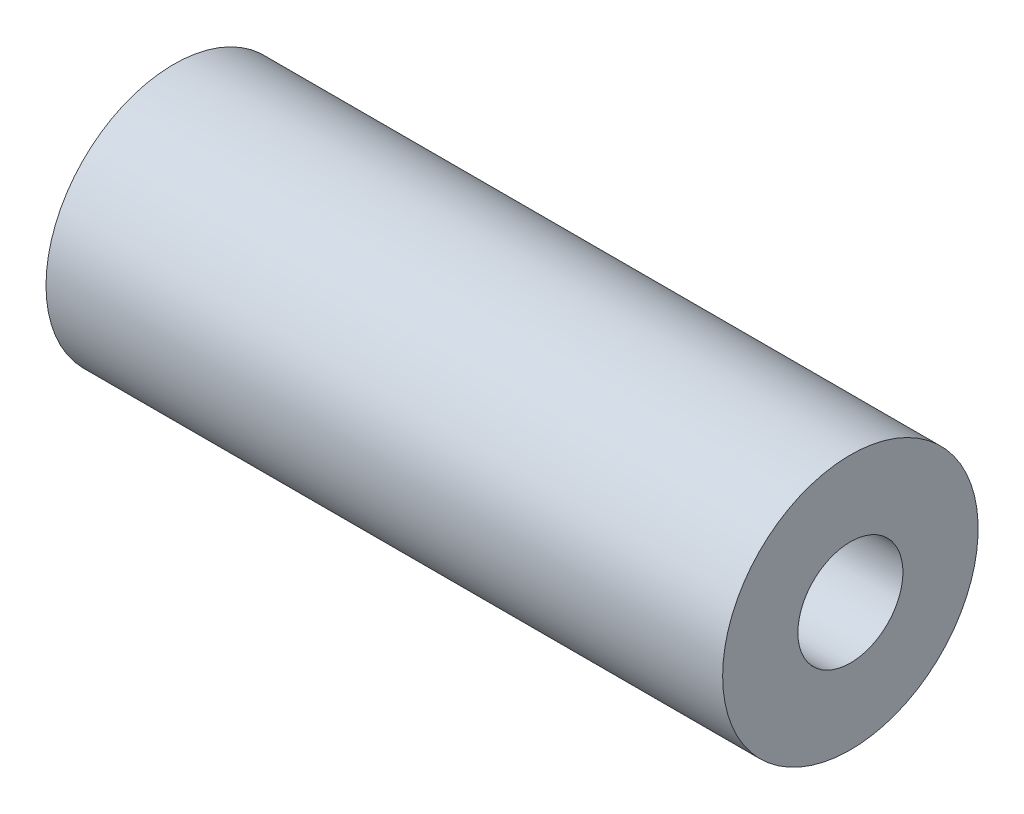
ISO-10303-21;
HEADER;
FILE_DESCRIPTION(('STEP AP214'),'2;1');
FILE_NAME('part.step','',(''),(''),'','','');
FILE_SCHEMA(('AUTOMOTIVE_DESIGN { 1 0 10303 214 1 1 1 1 }'));
ENDSEC;
DATA;
#1=APPLICATION_CONTEXT('core data for automotive mechanical design processes');
#2=APPLICATION_PROTOCOL_DEFINITION('international standard','automotive_design',2000,#1);
#3=PRODUCT_CONTEXT('',#1,'mechanical');
#4=PRODUCT('Part','Part','',(#3));
#5=PRODUCT_RELATED_PRODUCT_CATEGORY('part','',(#4));
#6=PRODUCT_DEFINITION_FORMATION('','',#4);
#7=PRODUCT_DEFINITION_CONTEXT('part definition',#1,'design');
#8=PRODUCT_DEFINITION('design','',#6,#7);
#9=PRODUCT_DEFINITION_SHAPE('','',#8);
#10=(LENGTH_UNIT() NAMED_UNIT(*) SI_UNIT(.MILLI.,.METRE.));
#11=(NAMED_UNIT(*) PLANE_ANGLE_UNIT() SI_UNIT($,.RADIAN.));
#12=(NAMED_UNIT(*) SI_UNIT($,.STERADIAN.) SOLID_ANGLE_UNIT());
#13=UNCERTAINTY_MEASURE_WITH_UNIT(LENGTH_MEASURE(1.E-05),#10,'distance_accuracy_value','');
#14=(GEOMETRIC_REPRESENTATION_CONTEXT(3) GLOBAL_UNCERTAINTY_ASSIGNED_CONTEXT((#13)) GLOBAL_UNIT_ASSIGNED_CONTEXT((#10,
#11,#12)) REPRESENTATION_CONTEXT('',''));
#15=CARTESIAN_POINT('',(0.,0.,0.));
#16=DIRECTION('',(0.,0.,1.));
#17=DIRECTION('',(1.,0.,0.));
#18=AXIS2_PLACEMENT_3D('',#15,#16,#17);
#19=CARTESIAN_POINT('',(-20.45,0.,0.));
#20=DIRECTION('',(1.,0.,0.));
#21=DIRECTION('',(0.,0.,-1.));
#22=AXIS2_PLACEMENT_3D('',#19,#20,#21);
#23=PLANE('',#22);
#24=CARTESIAN_POINT('',(-20.45,0.,0.));
#25=DIRECTION('',(1.,0.,0.));
#26=DIRECTION('',(0.,0.,-1.));
#27=AXIS2_PLACEMENT_3D('',#24,#25,#26);
#28=CIRCLE('',#27,3.175);
#29=CARTESIAN_POINT('',(-20.45,0.,-3.175));
#30=VERTEX_POINT('',#29);
#31=EDGE_CURVE('E51',#30,#30,#28,.F.);
#32=ORIENTED_EDGE('',*,*,#31,.F.);
#33=EDGE_LOOP('',(#32));
#34=FACE_BOUND('',#33,.T.);
#35=CARTESIAN_POINT('',(-20.45,0.,0.));
#36=DIRECTION('',(-1.,0.,0.));
#37=DIRECTION('',(0.,0.,1.));
#38=AXIS2_PLACEMENT_3D('',#35,#36,#37);
#39=CIRCLE('',#38,7.722);
#40=CARTESIAN_POINT('',(-20.45,0.,7.722));
#41=VERTEX_POINT('',#40);
#42=EDGE_CURVE('E10',#41,#41,#39,.T.);
#43=ORIENTED_EDGE('',*,*,#42,.T.);
#44=EDGE_LOOP('',(#43));
#45=FACE_BOUND('',#44,.T.);
#46=ADVANCED_FACE('F39',(#34,#45),#23,.F.);
#47=CARTESIAN_POINT('',(-1000.,0.,0.));
#48=DIRECTION('',(-1.,0.,0.));
#49=DIRECTION('',(0.,0.,1.));
#50=AXIS2_PLACEMENT_3D('',#47,#48,#49);
#51=CYLINDRICAL_SURFACE('',#50,7.722);
#52=ORIENTED_EDGE('',*,*,#42,.F.);
#53=EDGE_LOOP('',(#52));
#54=FACE_BOUND('',#53,.T.);
#55=CARTESIAN_POINT('',(20.4500000000001,0.,0.));
#56=DIRECTION('',(-1.,0.,0.));
#57=DIRECTION('',(0.,0.,1.));
#58=AXIS2_PLACEMENT_3D('',#55,#56,#57);
#59=CIRCLE('',#58,7.722);
#60=CARTESIAN_POINT('',(20.4500000000001,0.,7.722));
#61=VERTEX_POINT('',#60);
#62=EDGE_CURVE('E46',#61,#61,#59,.T.);
#63=ORIENTED_EDGE('',*,*,#62,.T.);
#64=EDGE_LOOP('',(#63));
#65=FACE_BOUND('',#64,.T.);
#66=ADVANCED_FACE('F77',(#54,#65),#51,.T.);
#67=CARTESIAN_POINT('',(20.45,7.722,0.));
#68=DIRECTION('',(-1.,0.,0.));
#69=DIRECTION('',(0.,0.,1.));
#70=AXIS2_PLACEMENT_3D('',#67,#68,#69);
#71=PLANE('',#70);
#72=CARTESIAN_POINT('',(20.4500000000001,0.,0.));
#73=DIRECTION('',(-1.,0.,0.));
#74=DIRECTION('',(0.,0.,1.));
#75=AXIS2_PLACEMENT_3D('',#72,#73,#74);
#76=CIRCLE('',#75,3.175);
#77=CARTESIAN_POINT('',(20.4500000000001,0.,3.175));
#78=VERTEX_POINT('',#77);
#79=EDGE_CURVE('E45',#78,#78,#76,.F.);
#80=ORIENTED_EDGE('',*,*,#79,.F.);
#81=EDGE_LOOP('',(#80));
#82=FACE_BOUND('',#81,.T.);
#83=ORIENTED_EDGE('',*,*,#62,.F.);
#84=EDGE_LOOP('',(#83));
#85=FACE_BOUND('',#84,.T.);
#86=ADVANCED_FACE('F88',(#82,#85),#71,.F.);
#87=CARTESIAN_POINT('',(-1000.,0.,0.));
#88=DIRECTION('',(-1.,0.,0.));
#89=DIRECTION('',(0.,0.,1.));
#90=AXIS2_PLACEMENT_3D('',#87,#88,#89);
#91=CYLINDRICAL_SURFACE('',#90,3.175);
#92=CARTESIAN_POINT('',(-5.24999999999998,0.,0.));
#93=DIRECTION('',(-1.,0.,0.));
#94=DIRECTION('',(0.,0.,1.));
#95=AXIS2_PLACEMENT_3D('',#92,#93,#94);
#96=CIRCLE('',#95,3.175);
#97=CARTESIAN_POINT('',(-5.24999999999998,0.,3.175));
#98=VERTEX_POINT('',#97);
#99=EDGE_CURVE('E54',#98,#98,#96,.T.);
#100=ORIENTED_EDGE('',*,*,#99,.F.);
#101=EDGE_LOOP('',(#100));
#102=FACE_BOUND('',#101,.T.);
#103=ORIENTED_EDGE('',*,*,#31,.T.);
#104=EDGE_LOOP('',(#103));
#105=FACE_BOUND('',#104,.T.);
#106=ADVANCED_FACE('F93',(#102,#105),#91,.F.);
#107=CARTESIAN_POINT('',(-5.25,3.175,0.));
#108=DIRECTION('',(-1.,0.,0.));
#109=DIRECTION('',(0.,0.,1.));
#110=AXIS2_PLACEMENT_3D('',#107,#108,#109);
#111=PLANE('',#110);
#112=ORIENTED_EDGE('',*,*,#99,.T.);
#113=EDGE_LOOP('',(#112));
#114=FACE_BOUND('',#113,.T.);
#115=ADVANCED_FACE('F78',(#114),#111,.T.);
#116=CARTESIAN_POINT('',(-1000.,0.,0.));
#117=DIRECTION('',(-1.,0.,0.));
#118=DIRECTION('',(0.,0.,1.));
#119=AXIS2_PLACEMENT_3D('',#116,#117,#118);
#120=CYLINDRICAL_SURFACE('',#119,3.175);
#121=CARTESIAN_POINT('',(5.24999999999998,0.,0.));
#122=DIRECTION('',(-1.,0.,0.));
#123=DIRECTION('',(0.,0.,1.));
#124=AXIS2_PLACEMENT_3D('',#121,#122,#123);
#125=CIRCLE('',#124,3.175);
#126=CARTESIAN_POINT('',(5.24999999999998,0.,3.175));
#127=VERTEX_POINT('',#126);
#128=EDGE_CURVE('E65',#127,#127,#125,.T.);
#129=ORIENTED_EDGE('',*,*,#128,.T.);
#130=EDGE_LOOP('',(#129));
#131=FACE_BOUND('',#130,.T.);
#132=ORIENTED_EDGE('',*,*,#79,.T.);
#133=EDGE_LOOP('',(#132));
#134=FACE_BOUND('',#133,.T.);
#135=ADVANCED_FACE('F67',(#131,#134),#120,.F.);
#136=CARTESIAN_POINT('',(5.25,0.,0.));
#137=DIRECTION('',(1.,0.,0.));
#138=DIRECTION('',(0.,0.,-1.));
#139=AXIS2_PLACEMENT_3D('',#136,#137,#138);
#140=PLANE('',#139);
#141=ORIENTED_EDGE('',*,*,#128,.F.);
#142=EDGE_LOOP('',(#141));
#143=FACE_BOUND('',#142,.T.);
#144=ADVANCED_FACE('F70',(#143),#140,.T.);
#145=CLOSED_SHELL('',(#46,#66,#86,#106,#115,#135,#144));
#146=MANIFOLD_SOLID_BREP('B2',#145);
#147=ADVANCED_BREP_SHAPE_REPRESENTATION('',(#18,#146),#14);
#148=SHAPE_DEFINITION_REPRESENTATION(#9,#147);
ENDSEC;
END-ISO-10303-21;
